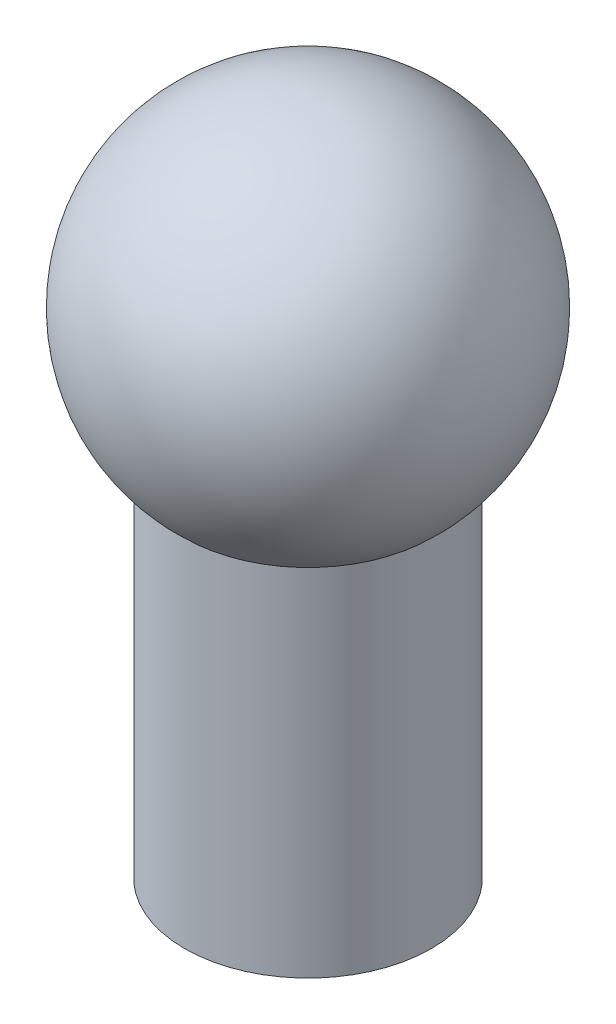
ISO-10303-21;
HEADER;
FILE_DESCRIPTION(('STEP AP214'),'2;1');
FILE_NAME('part.step','',(''),(''),'','','');
FILE_SCHEMA(('AUTOMOTIVE_DESIGN { 1 0 10303 214 1 1 1 1 }'));
ENDSEC;
DATA;
#1=APPLICATION_CONTEXT('core data for automotive mechanical design processes');
#2=APPLICATION_PROTOCOL_DEFINITION('international standard','automotive_design',2000,#1);
#3=PRODUCT_CONTEXT('',#1,'mechanical');
#4=PRODUCT('Part','Part','',(#3));
#5=PRODUCT_RELATED_PRODUCT_CATEGORY('part','',(#4));
#6=PRODUCT_DEFINITION_FORMATION('','',#4);
#7=PRODUCT_DEFINITION_CONTEXT('part definition',#1,'design');
#8=PRODUCT_DEFINITION('design','',#6,#7);
#9=PRODUCT_DEFINITION_SHAPE('','',#8);
#10=(LENGTH_UNIT() NAMED_UNIT(*) SI_UNIT(.MILLI.,.METRE.));
#11=(NAMED_UNIT(*) PLANE_ANGLE_UNIT() SI_UNIT($,.RADIAN.));
#12=(NAMED_UNIT(*) SI_UNIT($,.STERADIAN.) SOLID_ANGLE_UNIT());
#13=UNCERTAINTY_MEASURE_WITH_UNIT(LENGTH_MEASURE(1.E-05),#10,'distance_accuracy_value','');
#14=(GEOMETRIC_REPRESENTATION_CONTEXT(3) GLOBAL_UNCERTAINTY_ASSIGNED_CONTEXT((#13)) GLOBAL_UNIT_ASSIGNED_CONTEXT((#10,
#11,#12)) REPRESENTATION_CONTEXT('',''));
#15=CARTESIAN_POINT('',(0.,0.,0.));
#16=DIRECTION('',(0.,0.,1.));
#17=DIRECTION('',(1.,0.,0.));
#18=AXIS2_PLACEMENT_3D('',#15,#16,#17);
#19=CARTESIAN_POINT('',(0.,40.,0.));
#20=DIRECTION('',(0.,0.,1.));
#21=DIRECTION('',(-1.,0.,0.));
#22=AXIS2_PLACEMENT_3D('',#19,#20,#21);
#23=SPHERICAL_SURFACE('',#22,15.);
#24=CARTESIAN_POINT('',(0.,40.,0.));
#25=DIRECTION('',(0.,1.,0.));
#26=DIRECTION('',(0.,0.,1.));
#27=AXIS2_PLACEMENT_3D('',#24,#25,#26);
#28=SPHERICAL_SURFACE('',#27,15.);
#29=CARTESIAN_POINT('',(0.,28.8196601125011,0.));
#30=DIRECTION('',(0.,1.,0.));
#31=DIRECTION('',(0.,0.,1.));
#32=AXIS2_PLACEMENT_3D('',#29,#30,#31);
#33=CIRCLE('',#32,10.);
#34=CARTESIAN_POINT('',(0.,28.8196601125011,10.));
#35=VERTEX_POINT('',#34);
#36=EDGE_CURVE('E36',#35,#35,#33,.F.);
#37=ORIENTED_EDGE('',*,*,#36,.F.);
#38=EDGE_LOOP('',(#37));
#39=FACE_BOUND('',#38,.T.);
#40=ADVANCED_FACE('F32',(#39),#28,.T.);
#41=CARTESIAN_POINT('',(0.,40.,0.));
#42=DIRECTION('',(0.,-1.,0.));
#43=DIRECTION('',(0.,0.,-1.));
#44=AXIS2_PLACEMENT_3D('',#41,#42,#43);
#45=CYLINDRICAL_SURFACE('',#44,10.);
#46=ORIENTED_EDGE('',*,*,#36,.T.);
#47=EDGE_LOOP('',(#46));
#48=FACE_BOUND('',#47,.T.);
#49=CARTESIAN_POINT('',(0.,0.,0.));
#50=DIRECTION('',(0.,1.,0.));
#51=DIRECTION('',(0.,0.,1.));
#52=AXIS2_PLACEMENT_3D('',#49,#50,#51);
#53=CIRCLE('',#52,10.);
#54=CARTESIAN_POINT('',(0.,0.,10.));
#55=VERTEX_POINT('',#54);
#56=EDGE_CURVE('E10',#55,#55,#53,.T.);
#57=ORIENTED_EDGE('',*,*,#56,.T.);
#58=EDGE_LOOP('',(#57));
#59=FACE_BOUND('',#58,.T.);
#60=ADVANCED_FACE('F34',(#48,#59),#45,.T.);
#61=CARTESIAN_POINT('',(0.,0.,0.));
#62=DIRECTION('',(0.,1.,0.));
#63=DIRECTION('',(0.,0.,1.));
#64=AXIS2_PLACEMENT_3D('',#61,#62,#63);
#65=PLANE('',#64);
#66=ORIENTED_EDGE('',*,*,#56,.F.);
#67=EDGE_LOOP('',(#66));
#68=FACE_BOUND('',#67,.T.);
#69=ADVANCED_FACE('F51',(#68),#65,.F.);
#70=CLOSED_SHELL('',(#40,#60,#69));
#71=MANIFOLD_SOLID_BREP('B2',#70);
#72=ADVANCED_BREP_SHAPE_REPRESENTATION('',(#18,#71),#14);
#73=SHAPE_DEFINITION_REPRESENTATION(#9,#72);
ENDSEC;
END-ISO-10303-21;
